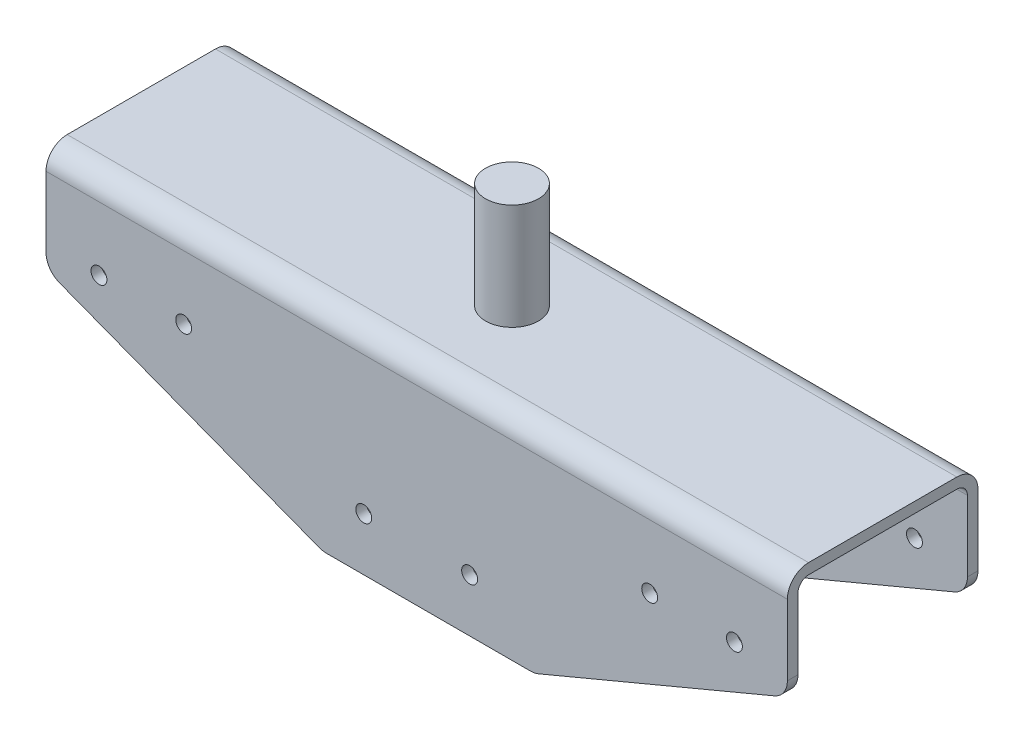
ISO-10303-21;
HEADER;
FILE_DESCRIPTION(('STEP AP214'),'2;1');
FILE_NAME('part.step','',(''),(''),'','','');
FILE_SCHEMA(('AUTOMOTIVE_DESIGN { 1 0 10303 214 1 1 1 1 }'));
ENDSEC;
DATA;
#1=APPLICATION_CONTEXT('core data for automotive mechanical design processes');
#2=APPLICATION_PROTOCOL_DEFINITION('international standard','automotive_design',2000,#1);
#3=PRODUCT_CONTEXT('',#1,'mechanical');
#4=PRODUCT('Part','Part','',(#3));
#5=PRODUCT_RELATED_PRODUCT_CATEGORY('part','',(#4));
#6=PRODUCT_DEFINITION_FORMATION('','',#4);
#7=PRODUCT_DEFINITION_CONTEXT('part definition',#1,'design');
#8=PRODUCT_DEFINITION('design','',#6,#7);
#9=PRODUCT_DEFINITION_SHAPE('','',#8);
#10=(LENGTH_UNIT() NAMED_UNIT(*) SI_UNIT(.MILLI.,.METRE.));
#11=(NAMED_UNIT(*) PLANE_ANGLE_UNIT() SI_UNIT($,.RADIAN.));
#12=(NAMED_UNIT(*) SI_UNIT($,.STERADIAN.) SOLID_ANGLE_UNIT());
#13=UNCERTAINTY_MEASURE_WITH_UNIT(LENGTH_MEASURE(1.E-05),#10,'distance_accuracy_value','');
#14=(GEOMETRIC_REPRESENTATION_CONTEXT(3) GLOBAL_UNCERTAINTY_ASSIGNED_CONTEXT((#13)) GLOBAL_UNIT_ASSIGNED_CONTEXT((#10,
#11,#12)) REPRESENTATION_CONTEXT('',''));
#15=CARTESIAN_POINT('',(0.,0.,0.));
#16=DIRECTION('',(0.,0.,1.));
#17=DIRECTION('',(1.,0.,0.));
#18=AXIS2_PLACEMENT_3D('',#15,#16,#17);
#19=CARTESIAN_POINT('',(-33.,1.37609249415543,9.));
#20=DIRECTION('',(0.,0.,-1.));
#21=DIRECTION('',(-1.,0.,0.));
#22=AXIS2_PLACEMENT_3D('',#19,#20,#21);
#23=CYLINDRICAL_SURFACE('',#22,2.);
#24=CARTESIAN_POINT('',(-33.,1.37609249415543,8.));
#25=DIRECTION('',(0.,0.,1.));
#26=DIRECTION('',(1.,0.,0.));
#27=AXIS2_PLACEMENT_3D('',#24,#25,#26);
#28=CIRCLE('',#27,2.);
#29=CARTESIAN_POINT('',(-33.714795211127,-0.491812162445079,8.));
#30=VERTEX_POINT('',#29);
#31=CARTESIAN_POINT('',(-35.,1.37609249415544,8.));
#32=VERTEX_POINT('',#31);
#33=EDGE_CURVE('E275',#30,#32,#28,.F.);
#34=ORIENTED_EDGE('',*,*,#33,.F.);
#35=DIRECTION('',(0.,0.,-1.));
#36=VECTOR('',#35,1.);
#37=CARTESIAN_POINT('',(-33.714795211127,-0.491812162445079,9.));
#38=LINE('',#37,#36);
#39=CARTESIAN_POINT('',(-33.714795211127,-0.491812162445079,9.));
#40=VERTEX_POINT('',#39);
#41=EDGE_CURVE('E360',#40,#30,#38,.T.);
#42=ORIENTED_EDGE('',*,*,#41,.F.);
#43=CARTESIAN_POINT('',(-33.,1.37609249415543,9.));
#44=DIRECTION('',(0.,0.,1.));
#45=DIRECTION('',(1.,0.,0.));
#46=AXIS2_PLACEMENT_3D('',#43,#44,#45);
#47=CIRCLE('',#46,2.);
#48=CARTESIAN_POINT('',(-35.,1.37609249415544,9.));
#49=VERTEX_POINT('',#48);
#50=EDGE_CURVE('E278',#40,#49,#47,.F.);
#51=ORIENTED_EDGE('',*,*,#50,.T.);
#52=DIRECTION('',(0.,0.,-1.));
#53=VECTOR('',#52,1.);
#54=CARTESIAN_POINT('',(-35.,1.37609249415544,9.));
#55=LINE('',#54,#53);
#56=EDGE_CURVE('E327',#49,#32,#55,.T.);
#57=ORIENTED_EDGE('',*,*,#56,.T.);
#58=EDGE_LOOP('',(#34,#42,#51,#57));
#59=FACE_BOUND('',#58,.T.);
#60=ADVANCED_FACE('F35',(#59),#23,.T.);
#61=CARTESIAN_POINT('',(-4.47065669618863,-11.6827314045743,9.));
#62=DIRECTION('',(0.357397605563513,0.933952328300255,0.));
#63=DIRECTION('',(-0.933952328300255,0.357397605563513,0.));
#64=AXIS2_PLACEMENT_3D('',#61,#62,#63);
#65=PLANE('',#64);
#66=ORIENTED_EDGE('',*,*,#41,.T.);
#67=DIRECTION('',(0.933952328300255,-0.357397605563513,0.));
#68=VECTOR('',#67,1.);
#69=CARTESIAN_POINT('',(-4.47065669618863,-11.6827314045743,8.));
#70=LINE('',#69,#68);
#71=CARTESIAN_POINT('',(-9.21316655172952,-9.86790465660051,8.));
#72=VERTEX_POINT('',#71);
#73=EDGE_CURVE('E272',#30,#72,#70,.T.);
#74=ORIENTED_EDGE('',*,*,#73,.T.);
#75=DIRECTION('',(0.,0.,-1.));
#76=VECTOR('',#75,1.);
#77=CARTESIAN_POINT('',(-9.21316655172952,-9.8679046566005,9.));
#78=LINE('',#77,#76);
#79=CARTESIAN_POINT('',(-9.21316655172952,-9.8679046566005,9.));
#80=VERTEX_POINT('',#79);
#81=EDGE_CURVE('E356',#80,#72,#78,.T.);
#82=ORIENTED_EDGE('',*,*,#81,.F.);
#83=DIRECTION('',(0.933952328300255,-0.357397605563513,0.));
#84=VECTOR('',#83,1.);
#85=CARTESIAN_POINT('',(-4.47065669618863,-11.6827314045743,9.));
#86=LINE('',#85,#84);
#87=EDGE_CURVE('E281',#40,#80,#86,.T.);
#88=ORIENTED_EDGE('',*,*,#87,.F.);
#89=EDGE_LOOP('',(#66,#74,#82,#88));
#90=FACE_BOUND('',#89,.T.);
#91=ADVANCED_FACE('F482',(#90),#65,.F.);
#92=CARTESIAN_POINT('',(-8.49837134060249,-8.,9.));
#93=DIRECTION('',(0.,0.,-1.));
#94=DIRECTION('',(-1.,0.,0.));
#95=AXIS2_PLACEMENT_3D('',#92,#93,#94);
#96=CYLINDRICAL_SURFACE('',#95,2.);
#97=CARTESIAN_POINT('',(-8.49837134060249,-8.,8.));
#98=DIRECTION('',(0.,0.,1.));
#99=DIRECTION('',(1.,0.,0.));
#100=AXIS2_PLACEMENT_3D('',#97,#98,#99);
#101=CIRCLE('',#100,2.);
#102=CARTESIAN_POINT('',(-8.49837134060248,-10.,8.));
#103=VERTEX_POINT('',#102);
#104=EDGE_CURVE('E270',#103,#72,#101,.F.);
#105=ORIENTED_EDGE('',*,*,#104,.F.);
#106=DIRECTION('',(0.,0.,-1.));
#107=VECTOR('',#106,1.);
#108=CARTESIAN_POINT('',(-8.49837134060248,-10.,9.));
#109=LINE('',#108,#107);
#110=CARTESIAN_POINT('',(-8.49837134060248,-10.,9.));
#111=VERTEX_POINT('',#110);
#112=EDGE_CURVE('E352',#111,#103,#109,.T.);
#113=ORIENTED_EDGE('',*,*,#112,.F.);
#114=CARTESIAN_POINT('',(-8.49837134060249,-8.,9.));
#115=DIRECTION('',(0.,0.,1.));
#116=DIRECTION('',(1.,0.,0.));
#117=AXIS2_PLACEMENT_3D('',#114,#115,#116);
#118=CIRCLE('',#117,2.);
#119=EDGE_CURVE('E284',#111,#80,#118,.F.);
#120=ORIENTED_EDGE('',*,*,#119,.T.);
#121=ORIENTED_EDGE('',*,*,#81,.T.);
#122=EDGE_LOOP('',(#105,#113,#120,#121));
#123=FACE_BOUND('',#122,.T.);
#124=ADVANCED_FACE('F488',(#123),#96,.T.);
#125=CARTESIAN_POINT('',(0.,-10.,9.));
#126=DIRECTION('',(0.,1.,0.));
#127=DIRECTION('',(0.,0.,1.));
#128=AXIS2_PLACEMENT_3D('',#125,#126,#127);
#129=PLANE('',#128);
#130=ORIENTED_EDGE('',*,*,#112,.T.);
#131=DIRECTION('',(1.,0.,0.));
#132=VECTOR('',#131,1.);
#133=CARTESIAN_POINT('',(0.,-10.,8.));
#134=LINE('',#133,#132);
#135=CARTESIAN_POINT('',(10.7299842112883,-10.,8.));
#136=VERTEX_POINT('',#135);
#137=EDGE_CURVE('E267',#103,#136,#134,.T.);
#138=ORIENTED_EDGE('',*,*,#137,.T.);
#139=DIRECTION('',(0.,0.,-1.));
#140=VECTOR('',#139,1.);
#141=CARTESIAN_POINT('',(10.7299842112883,-10.,9.));
#142=LINE('',#141,#140);
#143=CARTESIAN_POINT('',(10.7299842112883,-10.,9.));
#144=VERTEX_POINT('',#143);
#145=EDGE_CURVE('E348',#144,#136,#142,.T.);
#146=ORIENTED_EDGE('',*,*,#145,.F.);
#147=DIRECTION('',(1.,0.,0.));
#148=VECTOR('',#147,1.);
#149=CARTESIAN_POINT('',(0.,-10.,9.));
#150=LINE('',#149,#148);
#151=EDGE_CURVE('E287',#111,#144,#150,.T.);
#152=ORIENTED_EDGE('',*,*,#151,.F.);
#153=EDGE_LOOP('',(#130,#138,#146,#152));
#154=FACE_BOUND('',#153,.T.);
#155=ADVANCED_FACE('F503',(#154),#129,.F.);
#156=CARTESIAN_POINT('',(10.7299842112883,-8.,9.));
#157=DIRECTION('',(0.,0.,-1.));
#158=DIRECTION('',(-1.,0.,0.));
#159=AXIS2_PLACEMENT_3D('',#156,#157,#158);
#160=CYLINDRICAL_SURFACE('',#159,2.);
#161=CARTESIAN_POINT('',(10.7299842112883,-8.,8.));
#162=DIRECTION('',(0.,0.,1.));
#163=DIRECTION('',(1.,0.,0.));
#164=AXIS2_PLACEMENT_3D('',#161,#162,#163);
#165=CIRCLE('',#164,2.);
#166=CARTESIAN_POINT('',(11.5028360804316,-9.8446408833054,8.));
#167=VERTEX_POINT('',#166);
#168=EDGE_CURVE('E265',#167,#136,#165,.F.);
#169=ORIENTED_EDGE('',*,*,#168,.F.);
#170=DIRECTION('',(0.,0.,-1.));
#171=VECTOR('',#170,1.);
#172=CARTESIAN_POINT('',(11.5028360804316,-9.8446408833054,9.));
#173=LINE('',#172,#171);
#174=CARTESIAN_POINT('',(11.5028360804316,-9.8446408833054,9.));
#175=VERTEX_POINT('',#174);
#176=EDGE_CURVE('E344',#175,#167,#173,.T.);
#177=ORIENTED_EDGE('',*,*,#176,.F.);
#178=CARTESIAN_POINT('',(10.7299842112883,-8.,9.));
#179=DIRECTION('',(0.,0.,1.));
#180=DIRECTION('',(1.,0.,0.));
#181=AXIS2_PLACEMENT_3D('',#178,#179,#180);
#182=CIRCLE('',#181,2.);
#183=EDGE_CURVE('E289',#175,#144,#182,.F.);
#184=ORIENTED_EDGE('',*,*,#183,.T.);
#185=ORIENTED_EDGE('',*,*,#145,.T.);
#186=EDGE_LOOP('',(#169,#177,#184,#185));
#187=FACE_BOUND('',#186,.T.);
#188=ADVANCED_FACE('F505',(#187),#160,.T.);
#189=CARTESIAN_POINT('',(5.22637510183502,-12.4742988524063,9.));
#190=DIRECTION('',(-0.386425934571649,0.922320441652698,0.));
#191=DIRECTION('',(-0.922320441652698,-0.386425934571649,0.));
#192=AXIS2_PLACEMENT_3D('',#189,#190,#191);
#193=PLANE('',#192);
#194=ORIENTED_EDGE('',*,*,#176,.T.);
#195=DIRECTION('',(0.922320441652698,0.386425934571649,0.));
#196=VECTOR('',#195,1.);
#197=CARTESIAN_POINT('',(5.22637510183502,-12.4742988524063,8.));
#198=LINE('',#197,#196);
#199=CARTESIAN_POINT('',(33.7728518691433,-0.514140034101853,8.));
#200=VERTEX_POINT('',#199);
#201=EDGE_CURVE('E262',#167,#200,#198,.T.);
#202=ORIENTED_EDGE('',*,*,#201,.T.);
#203=DIRECTION('',(0.,0.,-1.));
#204=VECTOR('',#203,1.);
#205=CARTESIAN_POINT('',(33.7728518691433,-0.514140034101855,9.));
#206=LINE('',#205,#204);
#207=CARTESIAN_POINT('',(33.7728518691433,-0.514140034101855,9.));
#208=VERTEX_POINT('',#207);
#209=EDGE_CURVE('E340',#208,#200,#206,.T.);
#210=ORIENTED_EDGE('',*,*,#209,.F.);
#211=DIRECTION('',(0.922320441652698,0.386425934571649,0.));
#212=VECTOR('',#211,1.);
#213=CARTESIAN_POINT('',(5.22637510183502,-12.4742988524063,9.));
#214=LINE('',#213,#212);
#215=EDGE_CURVE('E292',#175,#208,#214,.T.);
#216=ORIENTED_EDGE('',*,*,#215,.F.);
#217=EDGE_LOOP('',(#194,#202,#210,#216));
#218=FACE_BOUND('',#217,.T.);
#219=ADVANCED_FACE('F478',(#218),#193,.F.);
#220=CARTESIAN_POINT('',(33.,1.33050084920354,9.));
#221=DIRECTION('',(0.,0.,-1.));
#222=DIRECTION('',(-1.,0.,0.));
#223=AXIS2_PLACEMENT_3D('',#220,#221,#222);
#224=CYLINDRICAL_SURFACE('',#223,2.);
#225=CARTESIAN_POINT('',(33.,1.33050084920354,8.));
#226=DIRECTION('',(0.,0.,1.));
#227=DIRECTION('',(1.,0.,0.));
#228=AXIS2_PLACEMENT_3D('',#225,#226,#227);
#229=CIRCLE('',#228,2.);
#230=CARTESIAN_POINT('',(35.,1.33050084920355,8.));
#231=VERTEX_POINT('',#230);
#232=EDGE_CURVE('E260',#231,#200,#229,.F.);
#233=ORIENTED_EDGE('',*,*,#232,.F.);
#234=DIRECTION('',(0.,0.,-1.));
#235=VECTOR('',#234,1.);
#236=CARTESIAN_POINT('',(35.,1.33050084920355,9.));
#237=LINE('',#236,#235);
#238=CARTESIAN_POINT('',(35.,1.33050084920355,9.));
#239=VERTEX_POINT('',#238);
#240=EDGE_CURVE('E337',#239,#231,#237,.T.);
#241=ORIENTED_EDGE('',*,*,#240,.F.);
#242=CARTESIAN_POINT('',(33.,1.33050084920354,9.));
#243=DIRECTION('',(0.,0.,1.));
#244=DIRECTION('',(1.,0.,0.));
#245=AXIS2_PLACEMENT_3D('',#242,#243,#244);
#246=CIRCLE('',#245,2.);
#247=EDGE_CURVE('E294',#239,#208,#246,.F.);
#248=ORIENTED_EDGE('',*,*,#247,.T.);
#249=ORIENTED_EDGE('',*,*,#209,.T.);
#250=EDGE_LOOP('',(#233,#241,#248,#249));
#251=FACE_BOUND('',#250,.T.);
#252=ADVANCED_FACE('F471',(#251),#224,.T.);
#253=CARTESIAN_POINT('',(-33.,1.37609249415543,-8.));
#254=DIRECTION('',(0.,0.,-1.));
#255=DIRECTION('',(-1.,0.,0.));
#256=AXIS2_PLACEMENT_3D('',#253,#254,#255);
#257=CIRCLE('',#256,2.);
#258=CARTESIAN_POINT('',(-35.,1.37609249415544,-8.));
#259=VERTEX_POINT('',#258);
#260=CARTESIAN_POINT('',(-33.714795211127,-0.491812162445079,-8.));
#261=VERTEX_POINT('',#260);
#262=EDGE_CURVE('E258',#259,#261,#257,.F.);
#263=ORIENTED_EDGE('',*,*,#262,.F.);
#264=CARTESIAN_POINT('',(-35.,1.37609249415544,-9.));
#265=VERTEX_POINT('',#264);
#266=EDGE_CURVE('E301',#259,#265,#55,.T.);
#267=ORIENTED_EDGE('',*,*,#266,.T.);
#268=CARTESIAN_POINT('',(-33.,1.37609249415543,-9.));
#269=DIRECTION('',(0.,0.,1.));
#270=DIRECTION('',(1.,0.,0.));
#271=AXIS2_PLACEMENT_3D('',#268,#269,#270);
#272=CIRCLE('',#271,2.);
#273=CARTESIAN_POINT('',(-33.714795211127,-0.491812162445079,-9.));
#274=VERTEX_POINT('',#273);
#275=EDGE_CURVE('E277',#274,#265,#272,.F.);
#276=ORIENTED_EDGE('',*,*,#275,.F.);
#277=EDGE_CURVE('E359',#261,#274,#38,.T.);
#278=ORIENTED_EDGE('',*,*,#277,.F.);
#279=EDGE_LOOP('',(#263,#267,#276,#278));
#280=FACE_BOUND('',#279,.T.);
#281=ADVANCED_FACE('F444',(#280),#23,.T.);
#282=CARTESIAN_POINT('',(-9.21316655172952,-9.86790465660051,-8.));
#283=VERTEX_POINT('',#282);
#284=CARTESIAN_POINT('',(-9.21316655172952,-9.8679046566005,-9.));
#285=VERTEX_POINT('',#284);
#286=EDGE_CURVE('E355',#283,#285,#78,.T.);
#287=ORIENTED_EDGE('',*,*,#286,.F.);
#288=DIRECTION('',(-0.933952328300255,0.357397605563513,0.));
#289=VECTOR('',#288,1.);
#290=CARTESIAN_POINT('',(-4.47065669618863,-11.6827314045743,-8.));
#291=LINE('',#290,#289);
#292=EDGE_CURVE('E255',#283,#261,#291,.T.);
#293=ORIENTED_EDGE('',*,*,#292,.T.);
#294=ORIENTED_EDGE('',*,*,#277,.T.);
#295=DIRECTION('',(0.933952328300255,-0.357397605563513,0.));
#296=VECTOR('',#295,1.);
#297=CARTESIAN_POINT('',(-4.47065669618863,-11.6827314045743,-9.));
#298=LINE('',#297,#296);
#299=EDGE_CURVE('E304',#274,#285,#298,.T.);
#300=ORIENTED_EDGE('',*,*,#299,.T.);
#301=EDGE_LOOP('',(#287,#293,#294,#300));
#302=FACE_BOUND('',#301,.T.);
#303=ADVANCED_FACE('F448',(#302),#65,.F.);
#304=CARTESIAN_POINT('',(-8.49837134060249,-8.,-8.));
#305=DIRECTION('',(0.,0.,-1.));
#306=DIRECTION('',(-1.,0.,0.));
#307=AXIS2_PLACEMENT_3D('',#304,#305,#306);
#308=CIRCLE('',#307,2.);
#309=CARTESIAN_POINT('',(-8.49837134060248,-10.,-8.));
#310=VERTEX_POINT('',#309);
#311=EDGE_CURVE('E253',#283,#310,#308,.F.);
#312=ORIENTED_EDGE('',*,*,#311,.F.);
#313=ORIENTED_EDGE('',*,*,#286,.T.);
#314=CARTESIAN_POINT('',(-8.49837134060249,-8.,-9.));
#315=DIRECTION('',(0.,0.,1.));
#316=DIRECTION('',(1.,0.,0.));
#317=AXIS2_PLACEMENT_3D('',#314,#315,#316);
#318=CIRCLE('',#317,2.);
#319=CARTESIAN_POINT('',(-8.49837134060248,-10.,-9.));
#320=VERTEX_POINT('',#319);
#321=EDGE_CURVE('E307',#320,#285,#318,.F.);
#322=ORIENTED_EDGE('',*,*,#321,.F.);
#323=EDGE_CURVE('E351',#310,#320,#109,.T.);
#324=ORIENTED_EDGE('',*,*,#323,.F.);
#325=EDGE_LOOP('',(#312,#313,#322,#324));
#326=FACE_BOUND('',#325,.T.);
#327=ADVANCED_FACE('F451',(#326),#96,.T.);
#328=CARTESIAN_POINT('',(10.7299842112883,-10.,-8.));
#329=VERTEX_POINT('',#328);
#330=CARTESIAN_POINT('',(10.7299842112883,-10.,-9.));
#331=VERTEX_POINT('',#330);
#332=EDGE_CURVE('E347',#329,#331,#142,.T.);
#333=ORIENTED_EDGE('',*,*,#332,.F.);
#334=DIRECTION('',(-1.,0.,0.));
#335=VECTOR('',#334,1.);
#336=CARTESIAN_POINT('',(0.,-10.,-8.));
#337=LINE('',#336,#335);
#338=EDGE_CURVE('E250',#329,#310,#337,.T.);
#339=ORIENTED_EDGE('',*,*,#338,.T.);
#340=ORIENTED_EDGE('',*,*,#323,.T.);
#341=DIRECTION('',(1.,0.,0.));
#342=VECTOR('',#341,1.);
#343=CARTESIAN_POINT('',(0.,-10.,-9.));
#344=LINE('',#343,#342);
#345=EDGE_CURVE('E310',#320,#331,#344,.T.);
#346=ORIENTED_EDGE('',*,*,#345,.T.);
#347=EDGE_LOOP('',(#333,#339,#340,#346));
#348=FACE_BOUND('',#347,.T.);
#349=ADVANCED_FACE('F456',(#348),#129,.F.);
#350=CARTESIAN_POINT('',(10.7299842112883,-8.,-8.));
#351=DIRECTION('',(0.,0.,-1.));
#352=DIRECTION('',(-1.,0.,0.));
#353=AXIS2_PLACEMENT_3D('',#350,#351,#352);
#354=CIRCLE('',#353,2.);
#355=CARTESIAN_POINT('',(11.5028360804316,-9.8446408833054,-8.));
#356=VERTEX_POINT('',#355);
#357=EDGE_CURVE('E248',#329,#356,#354,.F.);
#358=ORIENTED_EDGE('',*,*,#357,.F.);
#359=ORIENTED_EDGE('',*,*,#332,.T.);
#360=CARTESIAN_POINT('',(10.7299842112883,-8.,-9.));
#361=DIRECTION('',(0.,0.,1.));
#362=DIRECTION('',(1.,0.,0.));
#363=AXIS2_PLACEMENT_3D('',#360,#361,#362);
#364=CIRCLE('',#363,2.);
#365=CARTESIAN_POINT('',(11.5028360804316,-9.8446408833054,-9.));
#366=VERTEX_POINT('',#365);
#367=EDGE_CURVE('E313',#366,#331,#364,.F.);
#368=ORIENTED_EDGE('',*,*,#367,.F.);
#369=EDGE_CURVE('E343',#356,#366,#173,.T.);
#370=ORIENTED_EDGE('',*,*,#369,.F.);
#371=EDGE_LOOP('',(#358,#359,#368,#370));
#372=FACE_BOUND('',#371,.T.);
#373=ADVANCED_FACE('F460',(#372),#160,.T.);
#374=CARTESIAN_POINT('',(33.7728518691433,-0.514140034101853,-8.));
#375=VERTEX_POINT('',#374);
#376=CARTESIAN_POINT('',(33.7728518691433,-0.514140034101855,-9.));
#377=VERTEX_POINT('',#376);
#378=EDGE_CURVE('E339',#375,#377,#206,.T.);
#379=ORIENTED_EDGE('',*,*,#378,.F.);
#380=DIRECTION('',(-0.922320441652698,-0.386425934571649,0.));
#381=VECTOR('',#380,1.);
#382=CARTESIAN_POINT('',(5.22637510183502,-12.4742988524063,-8.));
#383=LINE('',#382,#381);
#384=EDGE_CURVE('E245',#375,#356,#383,.T.);
#385=ORIENTED_EDGE('',*,*,#384,.T.);
#386=ORIENTED_EDGE('',*,*,#369,.T.);
#387=DIRECTION('',(0.922320441652698,0.386425934571649,0.));
#388=VECTOR('',#387,1.);
#389=CARTESIAN_POINT('',(5.22637510183502,-12.4742988524063,-9.));
#390=LINE('',#389,#388);
#391=EDGE_CURVE('E316',#366,#377,#390,.T.);
#392=ORIENTED_EDGE('',*,*,#391,.T.);
#393=EDGE_LOOP('',(#379,#385,#386,#392));
#394=FACE_BOUND('',#393,.T.);
#395=ADVANCED_FACE('F464',(#394),#193,.F.);
#396=CARTESIAN_POINT('',(33.,1.33050084920354,-8.));
#397=DIRECTION('',(0.,0.,-1.));
#398=DIRECTION('',(-1.,0.,0.));
#399=AXIS2_PLACEMENT_3D('',#396,#397,#398);
#400=CIRCLE('',#399,2.);
#401=CARTESIAN_POINT('',(35.,1.33050084920355,-8.));
#402=VERTEX_POINT('',#401);
#403=EDGE_CURVE('E203',#375,#402,#400,.F.);
#404=ORIENTED_EDGE('',*,*,#403,.F.);
#405=ORIENTED_EDGE('',*,*,#378,.T.);
#406=CARTESIAN_POINT('',(33.,1.33050084920354,-9.));
#407=DIRECTION('',(0.,0.,1.));
#408=DIRECTION('',(1.,0.,0.));
#409=AXIS2_PLACEMENT_3D('',#406,#407,#408);
#410=CIRCLE('',#409,2.);
#411=CARTESIAN_POINT('',(35.,1.33050084920355,-9.));
#412=VERTEX_POINT('',#411);
#413=EDGE_CURVE('E319',#412,#377,#410,.F.);
#414=ORIENTED_EDGE('',*,*,#413,.F.);
#415=EDGE_CURVE('E336',#402,#412,#237,.T.);
#416=ORIENTED_EDGE('',*,*,#415,.F.);
#417=EDGE_LOOP('',(#404,#405,#414,#416));
#418=FACE_BOUND('',#417,.T.);
#419=ADVANCED_FACE('F468',(#418),#224,.T.);
#420=CARTESIAN_POINT('',(35.,0.,9.));
#421=DIRECTION('',(-1.,0.,0.));
#422=DIRECTION('',(0.,0.,1.));
#423=AXIS2_PLACEMENT_3D('',#420,#421,#422);
#424=PLANE('',#423);
#425=ORIENTED_EDGE('',*,*,#240,.T.);
#426=DIRECTION('',(0.,-1.,0.));
#427=VECTOR('',#426,1.);
#428=CARTESIAN_POINT('',(35.,8.,8.));
#429=LINE('',#428,#427);
#430=CARTESIAN_POINT('',(35.,8.,8.));
#431=VERTEX_POINT('',#430);
#432=EDGE_CURVE('E228',#431,#231,#429,.T.);
#433=ORIENTED_EDGE('',*,*,#432,.F.);
#434=CARTESIAN_POINT('',(35.,8.,7.));
#435=DIRECTION('',(1.,0.,0.));
#436=DIRECTION('',(0.,0.,-1.));
#437=AXIS2_PLACEMENT_3D('',#434,#435,#436);
#438=CIRCLE('',#437,1.);
#439=CARTESIAN_POINT('',(35.,9.,7.));
#440=VERTEX_POINT('',#439);
#441=EDGE_CURVE('E222',#440,#431,#438,.T.);
#442=ORIENTED_EDGE('',*,*,#441,.F.);
#443=DIRECTION('',(0.,0.,1.));
#444=VECTOR('',#443,1.);
#445=CARTESIAN_POINT('',(35.,9.,7.));
#446=LINE('',#445,#444);
#447=CARTESIAN_POINT('',(35.,9.,-7.));
#448=VERTEX_POINT('',#447);
#449=EDGE_CURVE('E220',#448,#440,#446,.T.);
#450=ORIENTED_EDGE('',*,*,#449,.F.);
#451=CARTESIAN_POINT('',(35.,8.,-7.));
#452=DIRECTION('',(1.,0.,0.));
#453=DIRECTION('',(0.,0.,-1.));
#454=AXIS2_PLACEMENT_3D('',#451,#452,#453);
#455=CIRCLE('',#454,1.);
#456=CARTESIAN_POINT('',(35.,8.,-8.));
#457=VERTEX_POINT('',#456);
#458=EDGE_CURVE('E207',#457,#448,#455,.T.);
#459=ORIENTED_EDGE('',*,*,#458,.F.);
#460=DIRECTION('',(0.,1.,0.));
#461=VECTOR('',#460,1.);
#462=CARTESIAN_POINT('',(35.,-14.234256749177,-8.));
#463=LINE('',#462,#461);
#464=EDGE_CURVE('E198',#402,#457,#463,.T.);
#465=ORIENTED_EDGE('',*,*,#464,.F.);
#466=ORIENTED_EDGE('',*,*,#415,.T.);
#467=DIRECTION('',(0.,1.,0.));
#468=VECTOR('',#467,1.);
#469=CARTESIAN_POINT('',(35.,0.,-9.));
#470=LINE('',#469,#468);
#471=CARTESIAN_POINT('',(35.,8.,-9.));
#472=VERTEX_POINT('',#471);
#473=EDGE_CURVE('E322',#412,#472,#470,.T.);
#474=ORIENTED_EDGE('',*,*,#473,.T.);
#475=CARTESIAN_POINT('',(35.,8.,-7.));
#476=DIRECTION('',(-1.,0.,0.));
#477=DIRECTION('',(0.,0.,1.));
#478=AXIS2_PLACEMENT_3D('',#475,#476,#477);
#479=CIRCLE('',#478,2.);
#480=CARTESIAN_POINT('',(35.,10.,-7.));
#481=VERTEX_POINT('',#480);
#482=EDGE_CURVE('E368',#472,#481,#479,.F.);
#483=ORIENTED_EDGE('',*,*,#482,.T.);
#484=DIRECTION('',(0.,0.,-1.));
#485=VECTOR('',#484,1.);
#486=CARTESIAN_POINT('',(35.,10.,9.));
#487=LINE('',#486,#485);
#488=CARTESIAN_POINT('',(35.,10.,7.));
#489=VERTEX_POINT('',#488);
#490=EDGE_CURVE('E333',#489,#481,#487,.T.);
#491=ORIENTED_EDGE('',*,*,#490,.F.);
#492=CARTESIAN_POINT('',(35.,8.,7.));
#493=DIRECTION('',(-1.,0.,0.));
#494=DIRECTION('',(0.,0.,1.));
#495=AXIS2_PLACEMENT_3D('',#492,#493,#494);
#496=CIRCLE('',#495,2.);
#497=CARTESIAN_POINT('',(35.,8.,9.));
#498=VERTEX_POINT('',#497);
#499=EDGE_CURVE('E366',#489,#498,#496,.F.);
#500=ORIENTED_EDGE('',*,*,#499,.T.);
#501=DIRECTION('',(0.,1.,0.));
#502=VECTOR('',#501,1.);
#503=CARTESIAN_POINT('',(35.,0.,9.));
#504=LINE('',#503,#502);
#505=EDGE_CURVE('E297',#239,#498,#504,.T.);
#506=ORIENTED_EDGE('',*,*,#505,.F.);
#507=EDGE_LOOP('',(#425,#433,#442,#450,#459,#465,#466,#474,#483,#491,#500,#506));
#508=FACE_BOUND('',#507,.T.);
#509=ADVANCED_FACE('F217',(#508),#424,.F.);
#510=CARTESIAN_POINT('',(0.,10.,9.));
#511=DIRECTION('',(0.,1.,0.));
#512=DIRECTION('',(0.,0.,1.));
#513=AXIS2_PLACEMENT_3D('',#510,#511,#512);
#514=PLANE('',#513);
#515=CARTESIAN_POINT('',(0.,10.,0.));
#516=DIRECTION('',(0.,1.,0.));
#517=DIRECTION('',(0.,0.,1.));
#518=AXIS2_PLACEMENT_3D('',#515,#516,#517);
#519=CIRCLE('',#518,2.5);
#520=CARTESIAN_POINT('',(0.,10.,2.5));
#521=VERTEX_POINT('',#520);
#522=EDGE_CURVE('E413',#521,#521,#519,.T.);
#523=ORIENTED_EDGE('',*,*,#522,.F.);
#524=EDGE_LOOP('',(#523));
#525=FACE_BOUND('',#524,.T.);
#526=ORIENTED_EDGE('',*,*,#490,.T.);
#527=DIRECTION('',(1.,0.,0.));
#528=VECTOR('',#527,1.);
#529=CARTESIAN_POINT('',(-35.,10.,-7.));
#530=LINE('',#529,#528);
#531=CARTESIAN_POINT('',(-35.,10.,-7.));
#532=VERTEX_POINT('',#531);
#533=EDGE_CURVE('E373',#481,#532,#530,.F.);
#534=ORIENTED_EDGE('',*,*,#533,.T.);
#535=DIRECTION('',(0.,0.,-1.));
#536=VECTOR('',#535,1.);
#537=CARTESIAN_POINT('',(-35.,10.,9.));
#538=LINE('',#537,#536);
#539=CARTESIAN_POINT('',(-35.,10.,7.));
#540=VERTEX_POINT('',#539);
#541=EDGE_CURVE('E330',#540,#532,#538,.T.);
#542=ORIENTED_EDGE('',*,*,#541,.F.);
#543=DIRECTION('',(1.,0.,0.));
#544=VECTOR('',#543,1.);
#545=CARTESIAN_POINT('',(0.,10.,7.));
#546=LINE('',#545,#544);
#547=EDGE_CURVE('E370',#540,#489,#546,.T.);
#548=ORIENTED_EDGE('',*,*,#547,.T.);
#549=EDGE_LOOP('',(#526,#534,#542,#548));
#550=FACE_BOUND('',#549,.T.);
#551=ADVANCED_FACE('F420',(#525,#550),#514,.T.);
#552=CARTESIAN_POINT('',(-35.,0.,9.));
#553=DIRECTION('',(-1.,0.,0.));
#554=DIRECTION('',(0.,0.,1.));
#555=AXIS2_PLACEMENT_3D('',#552,#553,#554);
#556=PLANE('',#555);
#557=DIRECTION('',(0.,-1.,0.));
#558=VECTOR('',#557,1.);
#559=CARTESIAN_POINT('',(-35.,8.,8.));
#560=LINE('',#559,#558);
#561=CARTESIAN_POINT('',(-35.,8.,8.));
#562=VERTEX_POINT('',#561);
#563=EDGE_CURVE('E214',#562,#32,#560,.T.);
#564=ORIENTED_EDGE('',*,*,#563,.T.);
#565=ORIENTED_EDGE('',*,*,#56,.F.);
#566=DIRECTION('',(0.,1.,0.));
#567=VECTOR('',#566,1.);
#568=CARTESIAN_POINT('',(-35.,0.,9.));
#569=LINE('',#568,#567);
#570=CARTESIAN_POINT('',(-35.,8.,9.));
#571=VERTEX_POINT('',#570);
#572=EDGE_CURVE('E299',#49,#571,#569,.T.);
#573=ORIENTED_EDGE('',*,*,#572,.T.);
#574=CARTESIAN_POINT('',(-35.,8.,7.));
#575=DIRECTION('',(-1.,0.,0.));
#576=DIRECTION('',(0.,0.,1.));
#577=AXIS2_PLACEMENT_3D('',#574,#575,#576);
#578=CIRCLE('',#577,2.);
#579=EDGE_CURVE('E375',#571,#540,#578,.T.);
#580=ORIENTED_EDGE('',*,*,#579,.T.);
#581=ORIENTED_EDGE('',*,*,#541,.T.);
#582=CARTESIAN_POINT('',(-35.,8.,-7.));
#583=DIRECTION('',(-1.,0.,0.));
#584=DIRECTION('',(0.,0.,1.));
#585=AXIS2_PLACEMENT_3D('',#582,#583,#584);
#586=CIRCLE('',#585,2.);
#587=CARTESIAN_POINT('',(-35.,8.,-9.));
#588=VERTEX_POINT('',#587);
#589=EDGE_CURVE('E377',#532,#588,#586,.T.);
#590=ORIENTED_EDGE('',*,*,#589,.T.);
#591=DIRECTION('',(0.,1.,0.));
#592=VECTOR('',#591,1.);
#593=CARTESIAN_POINT('',(-35.,0.,-9.));
#594=LINE('',#593,#592);
#595=EDGE_CURVE('E282',#265,#588,#594,.T.);
#596=ORIENTED_EDGE('',*,*,#595,.F.);
#597=ORIENTED_EDGE('',*,*,#266,.F.);
#598=DIRECTION('',(0.,-1.,0.));
#599=VECTOR('',#598,1.);
#600=CARTESIAN_POINT('',(-35.,0.,-8.));
#601=LINE('',#600,#599);
#602=CARTESIAN_POINT('',(-35.,8.,-8.));
#603=VERTEX_POINT('',#602);
#604=EDGE_CURVE('E11',#603,#259,#601,.T.);
#605=ORIENTED_EDGE('',*,*,#604,.F.);
#606=CARTESIAN_POINT('',(-35.,8.,-7.));
#607=DIRECTION('',(1.,0.,0.));
#608=DIRECTION('',(0.,0.,-1.));
#609=AXIS2_PLACEMENT_3D('',#606,#607,#608);
#610=CIRCLE('',#609,1.);
#611=CARTESIAN_POINT('',(-35.,9.,-7.));
#612=VERTEX_POINT('',#611);
#613=EDGE_CURVE('E52',#603,#612,#610,.T.);
#614=ORIENTED_EDGE('',*,*,#613,.T.);
#615=DIRECTION('',(0.,0.,1.));
#616=VECTOR('',#615,1.);
#617=CARTESIAN_POINT('',(-35.,9.,7.));
#618=LINE('',#617,#616);
#619=CARTESIAN_POINT('',(-35.,9.,7.));
#620=VERTEX_POINT('',#619);
#621=EDGE_CURVE('E231',#612,#620,#618,.T.);
#622=ORIENTED_EDGE('',*,*,#621,.T.);
#623=CARTESIAN_POINT('',(-35.,8.,7.));
#624=DIRECTION('',(1.,0.,0.));
#625=DIRECTION('',(0.,0.,-1.));
#626=AXIS2_PLACEMENT_3D('',#623,#624,#625);
#627=CIRCLE('',#626,1.);
#628=EDGE_CURVE('E234',#620,#562,#627,.T.);
#629=ORIENTED_EDGE('',*,*,#628,.T.);
#630=EDGE_LOOP('',(#564,#565,#573,#580,#581,#590,#596,#597,#605,#614,#622,#629));
#631=FACE_BOUND('',#630,.T.);
#632=ADVANCED_FACE('F423',(#631),#556,.T.);
#633=CARTESIAN_POINT('',(0.,0.,9.));
#634=DIRECTION('',(0.,0.,1.));
#635=DIRECTION('',(1.,0.,0.));
#636=AXIS2_PLACEMENT_3D('',#633,#634,#635);
#637=PLANE('',#636);
#638=CARTESIAN_POINT('',(-30.,2.,9.));
#639=DIRECTION('',(0.,0.,1.));
#640=DIRECTION('',(1.,0.,0.));
#641=AXIS2_PLACEMENT_3D('',#638,#639,#640);
#642=CIRCLE('',#641,0.750000000000002);
#643=CARTESIAN_POINT('',(-29.25,2.,9.));
#644=VERTEX_POINT('',#643);
#645=EDGE_CURVE('E859',#644,#644,#642,.T.);
#646=ORIENTED_EDGE('',*,*,#645,.F.);
#647=EDGE_LOOP('',(#646));
#648=FACE_BOUND('',#647,.T.);
#649=CARTESIAN_POINT('',(-22.,2.,9.));
#650=DIRECTION('',(0.,0.,1.));
#651=DIRECTION('',(1.,0.,0.));
#652=AXIS2_PLACEMENT_3D('',#649,#650,#651);
#653=CIRCLE('',#652,0.750000000000002);
#654=CARTESIAN_POINT('',(-21.25,2.,9.));
#655=VERTEX_POINT('',#654);
#656=EDGE_CURVE('E897',#655,#655,#653,.T.);
#657=ORIENTED_EDGE('',*,*,#656,.F.);
#658=EDGE_LOOP('',(#657));
#659=FACE_BOUND('',#658,.T.);
#660=CARTESIAN_POINT('',(-5.,-5.,9.));
#661=DIRECTION('',(0.,0.,1.));
#662=DIRECTION('',(1.,0.,0.));
#663=AXIS2_PLACEMENT_3D('',#660,#661,#662);
#664=CIRCLE('',#663,0.75);
#665=CARTESIAN_POINT('',(-4.25,-5.,9.));
#666=VERTEX_POINT('',#665);
#667=EDGE_CURVE('E891',#666,#666,#664,.T.);
#668=ORIENTED_EDGE('',*,*,#667,.F.);
#669=EDGE_LOOP('',(#668));
#670=FACE_BOUND('',#669,.T.);
#671=CARTESIAN_POINT('',(5.,-5.,9.));
#672=DIRECTION('',(0.,0.,1.));
#673=DIRECTION('',(-1.,0.,0.));
#674=AXIS2_PLACEMENT_3D('',#671,#672,#673);
#675=CIRCLE('',#674,0.75);
#676=CARTESIAN_POINT('',(4.25,-5.,9.));
#677=VERTEX_POINT('',#676);
#678=EDGE_CURVE('E885',#677,#677,#675,.T.);
#679=ORIENTED_EDGE('',*,*,#678,.F.);
#680=EDGE_LOOP('',(#679));
#681=FACE_BOUND('',#680,.T.);
#682=CARTESIAN_POINT('',(22.,2.,9.));
#683=DIRECTION('',(0.,0.,1.));
#684=DIRECTION('',(-1.,0.,0.));
#685=AXIS2_PLACEMENT_3D('',#682,#683,#684);
#686=CIRCLE('',#685,0.750000000000002);
#687=CARTESIAN_POINT('',(21.25,2.,9.));
#688=VERTEX_POINT('',#687);
#689=EDGE_CURVE('E878',#688,#688,#686,.T.);
#690=ORIENTED_EDGE('',*,*,#689,.F.);
#691=EDGE_LOOP('',(#690));
#692=FACE_BOUND('',#691,.T.);
#693=CARTESIAN_POINT('',(30.,2.,9.));
#694=DIRECTION('',(0.,0.,1.));
#695=DIRECTION('',(-1.,0.,0.));
#696=AXIS2_PLACEMENT_3D('',#693,#694,#695);
#697=CIRCLE('',#696,0.750000000000002);
#698=CARTESIAN_POINT('',(29.25,2.,9.));
#699=VERTEX_POINT('',#698);
#700=EDGE_CURVE('E879',#699,#699,#697,.T.);
#701=ORIENTED_EDGE('',*,*,#700,.F.);
#702=EDGE_LOOP('',(#701));
#703=FACE_BOUND('',#702,.T.);
#704=ORIENTED_EDGE('',*,*,#505,.T.);
#705=DIRECTION('',(1.,0.,0.));
#706=VECTOR('',#705,1.);
#707=CARTESIAN_POINT('',(0.,8.,9.));
#708=LINE('',#707,#706);
#709=EDGE_CURVE('E44',#498,#571,#708,.F.);
#710=ORIENTED_EDGE('',*,*,#709,.T.);
#711=ORIENTED_EDGE('',*,*,#572,.F.);
#712=ORIENTED_EDGE('',*,*,#50,.F.);
#713=ORIENTED_EDGE('',*,*,#87,.T.);
#714=ORIENTED_EDGE('',*,*,#119,.F.);
#715=ORIENTED_EDGE('',*,*,#151,.T.);
#716=ORIENTED_EDGE('',*,*,#183,.F.);
#717=ORIENTED_EDGE('',*,*,#215,.T.);
#718=ORIENTED_EDGE('',*,*,#247,.F.);
#719=EDGE_LOOP('',(#704,#710,#711,#712,#713,#714,#715,#716,#717,#718));
#720=FACE_BOUND('',#719,.T.);
#721=ADVANCED_FACE('F523',(#648,#659,#670,#681,#692,#703,#720),#637,.T.);
#722=CARTESIAN_POINT('',(0.,0.,-9.));
#723=DIRECTION('',(0.,0.,1.));
#724=DIRECTION('',(1.,0.,0.));
#725=AXIS2_PLACEMENT_3D('',#722,#723,#724);
#726=PLANE('',#725);
#727=CARTESIAN_POINT('',(-30.,2.,-9.));
#728=DIRECTION('',(0.,0.,1.));
#729=DIRECTION('',(1.,0.,0.));
#730=AXIS2_PLACEMENT_3D('',#727,#728,#729);
#731=CIRCLE('',#730,0.750000000000002);
#732=CARTESIAN_POINT('',(-29.25,2.,-9.));
#733=VERTEX_POINT('',#732);
#734=EDGE_CURVE('E384',#733,#733,#731,.T.);
#735=ORIENTED_EDGE('',*,*,#734,.T.);
#736=EDGE_LOOP('',(#735));
#737=FACE_BOUND('',#736,.T.);
#738=CARTESIAN_POINT('',(-22.,2.,-9.));
#739=DIRECTION('',(0.,0.,1.));
#740=DIRECTION('',(1.,0.,0.));
#741=AXIS2_PLACEMENT_3D('',#738,#739,#740);
#742=CIRCLE('',#741,0.750000000000002);
#743=CARTESIAN_POINT('',(-21.25,2.,-9.));
#744=VERTEX_POINT('',#743);
#745=EDGE_CURVE('E900',#744,#744,#742,.T.);
#746=ORIENTED_EDGE('',*,*,#745,.T.);
#747=EDGE_LOOP('',(#746));
#748=FACE_BOUND('',#747,.T.);
#749=CARTESIAN_POINT('',(-5.,-5.,-9.));
#750=DIRECTION('',(0.,0.,1.));
#751=DIRECTION('',(1.,0.,0.));
#752=AXIS2_PLACEMENT_3D('',#749,#750,#751);
#753=CIRCLE('',#752,0.75);
#754=CARTESIAN_POINT('',(-4.25,-5.,-9.));
#755=VERTEX_POINT('',#754);
#756=EDGE_CURVE('E894',#755,#755,#753,.T.);
#757=ORIENTED_EDGE('',*,*,#756,.T.);
#758=EDGE_LOOP('',(#757));
#759=FACE_BOUND('',#758,.T.);
#760=CARTESIAN_POINT('',(5.,-5.,-9.));
#761=DIRECTION('',(0.,0.,1.));
#762=DIRECTION('',(-1.,0.,0.));
#763=AXIS2_PLACEMENT_3D('',#760,#761,#762);
#764=CIRCLE('',#763,0.75);
#765=CARTESIAN_POINT('',(4.25,-5.,-9.));
#766=VERTEX_POINT('',#765);
#767=EDGE_CURVE('E888',#766,#766,#764,.T.);
#768=ORIENTED_EDGE('',*,*,#767,.T.);
#769=EDGE_LOOP('',(#768));
#770=FACE_BOUND('',#769,.T.);
#771=CARTESIAN_POINT('',(22.,2.,-9.));
#772=DIRECTION('',(0.,0.,1.));
#773=DIRECTION('',(-1.,0.,0.));
#774=AXIS2_PLACEMENT_3D('',#771,#772,#773);
#775=CIRCLE('',#774,0.750000000000002);
#776=CARTESIAN_POINT('',(21.25,2.,-9.));
#777=VERTEX_POINT('',#776);
#778=EDGE_CURVE('E882',#777,#777,#775,.T.);
#779=ORIENTED_EDGE('',*,*,#778,.T.);
#780=EDGE_LOOP('',(#779));
#781=FACE_BOUND('',#780,.T.);
#782=CARTESIAN_POINT('',(30.,2.,-9.));
#783=DIRECTION('',(0.,0.,1.));
#784=DIRECTION('',(-1.,0.,0.));
#785=AXIS2_PLACEMENT_3D('',#782,#783,#784);
#786=CIRCLE('',#785,0.750000000000002);
#787=CARTESIAN_POINT('',(29.25,2.,-9.));
#788=VERTEX_POINT('',#787);
#789=EDGE_CURVE('E875',#788,#788,#786,.T.);
#790=ORIENTED_EDGE('',*,*,#789,.T.);
#791=EDGE_LOOP('',(#790));
#792=FACE_BOUND('',#791,.T.);
#793=ORIENTED_EDGE('',*,*,#595,.T.);
#794=DIRECTION('',(1.,0.,0.));
#795=VECTOR('',#794,1.);
#796=CARTESIAN_POINT('',(35.,8.,-9.));
#797=LINE('',#796,#795);
#798=EDGE_CURVE('E363',#588,#472,#797,.T.);
#799=ORIENTED_EDGE('',*,*,#798,.T.);
#800=ORIENTED_EDGE('',*,*,#473,.F.);
#801=ORIENTED_EDGE('',*,*,#413,.T.);
#802=ORIENTED_EDGE('',*,*,#391,.F.);
#803=ORIENTED_EDGE('',*,*,#367,.T.);
#804=ORIENTED_EDGE('',*,*,#345,.F.);
#805=ORIENTED_EDGE('',*,*,#321,.T.);
#806=ORIENTED_EDGE('',*,*,#299,.F.);
#807=ORIENTED_EDGE('',*,*,#275,.T.);
#808=EDGE_LOOP('',(#793,#799,#800,#801,#802,#803,#804,#805,#806,#807));
#809=FACE_BOUND('',#808,.T.);
#810=ADVANCED_FACE('F437',(#737,#748,#759,#770,#781,#792,#809),#726,.F.);
#811=CARTESIAN_POINT('',(0.,8.,-7.));
#812=DIRECTION('',(-1.,0.,0.));
#813=DIRECTION('',(0.,0.,1.));
#814=AXIS2_PLACEMENT_3D('',#811,#812,#813);
#815=CYLINDRICAL_SURFACE('',#814,2.);
#816=ORIENTED_EDGE('',*,*,#589,.F.);
#817=ORIENTED_EDGE('',*,*,#533,.F.);
#818=ORIENTED_EDGE('',*,*,#482,.F.);
#819=ORIENTED_EDGE('',*,*,#798,.F.);
#820=EDGE_LOOP('',(#816,#817,#818,#819));
#821=FACE_BOUND('',#820,.T.);
#822=ADVANCED_FACE('F431',(#821),#815,.T.);
#823=CARTESIAN_POINT('',(0.,8.,7.));
#824=DIRECTION('',(1.,0.,0.));
#825=DIRECTION('',(0.,0.,-1.));
#826=AXIS2_PLACEMENT_3D('',#823,#824,#825);
#827=CYLINDRICAL_SURFACE('',#826,2.);
#828=ORIENTED_EDGE('',*,*,#579,.F.);
#829=ORIENTED_EDGE('',*,*,#709,.F.);
#830=ORIENTED_EDGE('',*,*,#499,.F.);
#831=ORIENTED_EDGE('',*,*,#547,.F.);
#832=EDGE_LOOP('',(#828,#829,#830,#831));
#833=FACE_BOUND('',#832,.T.);
#834=ADVANCED_FACE('F37',(#833),#827,.T.);
#835=CARTESIAN_POINT('',(-35.,8.,8.));
#836=DIRECTION('',(0.,0.,1.));
#837=DIRECTION('',(1.,0.,0.));
#838=AXIS2_PLACEMENT_3D('',#835,#836,#837);
#839=PLANE('',#838);
#840=CARTESIAN_POINT('',(-30.,2.,8.));
#841=DIRECTION('',(0.,0.,1.));
#842=DIRECTION('',(1.,0.,0.));
#843=AXIS2_PLACEMENT_3D('',#840,#841,#842);
#844=CIRCLE('',#843,0.750000000000002);
#845=CARTESIAN_POINT('',(-29.25,2.,8.));
#846=VERTEX_POINT('',#845);
#847=EDGE_CURVE('E410',#846,#846,#844,.T.);
#848=ORIENTED_EDGE('',*,*,#847,.T.);
#849=EDGE_LOOP('',(#848));
#850=FACE_BOUND('',#849,.T.);
#851=CARTESIAN_POINT('',(-22.,2.,8.));
#852=DIRECTION('',(0.,0.,1.));
#853=DIRECTION('',(1.,0.,0.));
#854=AXIS2_PLACEMENT_3D('',#851,#852,#853);
#855=CIRCLE('',#854,0.750000000000002);
#856=CARTESIAN_POINT('',(-21.25,2.,8.));
#857=VERTEX_POINT('',#856);
#858=EDGE_CURVE('E398',#857,#857,#855,.T.);
#859=ORIENTED_EDGE('',*,*,#858,.T.);
#860=EDGE_LOOP('',(#859));
#861=FACE_BOUND('',#860,.T.);
#862=CARTESIAN_POINT('',(-5.,-5.,8.));
#863=DIRECTION('',(0.,0.,1.));
#864=DIRECTION('',(1.,0.,0.));
#865=AXIS2_PLACEMENT_3D('',#862,#863,#864);
#866=CIRCLE('',#865,0.75);
#867=CARTESIAN_POINT('',(-4.25,-5.,8.));
#868=VERTEX_POINT('',#867);
#869=EDGE_CURVE('E395',#868,#868,#866,.T.);
#870=ORIENTED_EDGE('',*,*,#869,.T.);
#871=EDGE_LOOP('',(#870));
#872=FACE_BOUND('',#871,.T.);
#873=CARTESIAN_POINT('',(5.,-5.,8.));
#874=DIRECTION('',(0.,0.,1.));
#875=DIRECTION('',(1.,0.,0.));
#876=AXIS2_PLACEMENT_3D('',#873,#874,#875);
#877=CIRCLE('',#876,0.75);
#878=CARTESIAN_POINT('',(5.75,-5.,8.));
#879=VERTEX_POINT('',#878);
#880=EDGE_CURVE('E392',#879,#879,#877,.T.);
#881=ORIENTED_EDGE('',*,*,#880,.T.);
#882=EDGE_LOOP('',(#881));
#883=FACE_BOUND('',#882,.T.);
#884=CARTESIAN_POINT('',(22.,2.,8.));
#885=DIRECTION('',(0.,0.,1.));
#886=DIRECTION('',(1.,0.,0.));
#887=AXIS2_PLACEMENT_3D('',#884,#885,#886);
#888=CIRCLE('',#887,0.750000000000002);
#889=CARTESIAN_POINT('',(22.75,2.,8.));
#890=VERTEX_POINT('',#889);
#891=EDGE_CURVE('E388',#890,#890,#888,.T.);
#892=ORIENTED_EDGE('',*,*,#891,.T.);
#893=EDGE_LOOP('',(#892));
#894=FACE_BOUND('',#893,.T.);
#895=CARTESIAN_POINT('',(30.,2.,8.));
#896=DIRECTION('',(0.,0.,1.));
#897=DIRECTION('',(1.,0.,0.));
#898=AXIS2_PLACEMENT_3D('',#895,#896,#897);
#899=CIRCLE('',#898,0.750000000000002);
#900=CARTESIAN_POINT('',(30.75,2.,8.));
#901=VERTEX_POINT('',#900);
#902=EDGE_CURVE('E383',#901,#901,#899,.T.);
#903=ORIENTED_EDGE('',*,*,#902,.T.);
#904=EDGE_LOOP('',(#903));
#905=FACE_BOUND('',#904,.T.);
#906=ORIENTED_EDGE('',*,*,#33,.T.);
#907=ORIENTED_EDGE('',*,*,#563,.F.);
#908=DIRECTION('',(1.,0.,0.));
#909=VECTOR('',#908,1.);
#910=CARTESIAN_POINT('',(-35.,8.,8.));
#911=LINE('',#910,#909);
#912=EDGE_CURVE('E239',#562,#431,#911,.T.);
#913=ORIENTED_EDGE('',*,*,#912,.T.);
#914=ORIENTED_EDGE('',*,*,#432,.T.);
#915=ORIENTED_EDGE('',*,*,#232,.T.);
#916=ORIENTED_EDGE('',*,*,#201,.F.);
#917=ORIENTED_EDGE('',*,*,#168,.T.);
#918=ORIENTED_EDGE('',*,*,#137,.F.);
#919=ORIENTED_EDGE('',*,*,#104,.T.);
#920=ORIENTED_EDGE('',*,*,#73,.F.);
#921=EDGE_LOOP('',(#906,#907,#913,#914,#915,#916,#917,#918,#919,#920));
#922=FACE_BOUND('',#921,.T.);
#923=ADVANCED_FACE('F527',(#850,#861,#872,#883,#894,#905,#922),#839,.F.);
#924=CARTESIAN_POINT('',(-35.,8.,7.));
#925=DIRECTION('',(1.,0.,0.));
#926=DIRECTION('',(0.,0.,-1.));
#927=AXIS2_PLACEMENT_3D('',#924,#925,#926);
#928=CYLINDRICAL_SURFACE('',#927,1.);
#929=ORIENTED_EDGE('',*,*,#912,.F.);
#930=ORIENTED_EDGE('',*,*,#628,.F.);
#931=DIRECTION('',(1.,0.,0.));
#932=VECTOR('',#931,1.);
#933=CARTESIAN_POINT('',(-35.,9.,7.));
#934=LINE('',#933,#932);
#935=EDGE_CURVE('E241',#620,#440,#934,.T.);
#936=ORIENTED_EDGE('',*,*,#935,.T.);
#937=ORIENTED_EDGE('',*,*,#441,.T.);
#938=EDGE_LOOP('',(#929,#930,#936,#937));
#939=FACE_BOUND('',#938,.T.);
#940=ADVANCED_FACE('F538',(#939),#928,.F.);
#941=CARTESIAN_POINT('',(-35.,9.,7.));
#942=DIRECTION('',(0.,1.,0.));
#943=DIRECTION('',(0.,0.,1.));
#944=AXIS2_PLACEMENT_3D('',#941,#942,#943);
#945=PLANE('',#944);
#946=ORIENTED_EDGE('',*,*,#935,.F.);
#947=ORIENTED_EDGE('',*,*,#621,.F.);
#948=DIRECTION('',(1.,0.,0.));
#949=VECTOR('',#948,1.);
#950=CARTESIAN_POINT('',(-35.,9.,-7.));
#951=LINE('',#950,#949);
#952=EDGE_CURVE('E213',#612,#448,#951,.T.);
#953=ORIENTED_EDGE('',*,*,#952,.T.);
#954=ORIENTED_EDGE('',*,*,#449,.T.);
#955=EDGE_LOOP('',(#946,#947,#953,#954));
#956=FACE_BOUND('',#955,.T.);
#957=ADVANCED_FACE('F731',(#956),#945,.F.);
#958=CARTESIAN_POINT('',(-35.,8.,-7.));
#959=DIRECTION('',(1.,0.,0.));
#960=DIRECTION('',(0.,0.,-1.));
#961=AXIS2_PLACEMENT_3D('',#958,#959,#960);
#962=CYLINDRICAL_SURFACE('',#961,1.);
#963=ORIENTED_EDGE('',*,*,#952,.F.);
#964=ORIENTED_EDGE('',*,*,#613,.F.);
#965=DIRECTION('',(1.,0.,0.));
#966=VECTOR('',#965,1.);
#967=CARTESIAN_POINT('',(-35.,8.,-8.));
#968=LINE('',#967,#966);
#969=EDGE_CURVE('E200',#603,#457,#968,.T.);
#970=ORIENTED_EDGE('',*,*,#969,.T.);
#971=ORIENTED_EDGE('',*,*,#458,.T.);
#972=EDGE_LOOP('',(#963,#964,#970,#971));
#973=FACE_BOUND('',#972,.T.);
#974=ADVANCED_FACE('F211',(#973),#962,.F.);
#975=CARTESIAN_POINT('',(-35.,8.,-8.));
#976=DIRECTION('',(0.,0.,-1.));
#977=DIRECTION('',(-1.,0.,0.));
#978=AXIS2_PLACEMENT_3D('',#975,#976,#977);
#979=PLANE('',#978);
#980=CARTESIAN_POINT('',(-30.,2.,-8.));
#981=DIRECTION('',(0.,0.,-1.));
#982=DIRECTION('',(-1.,0.,0.));
#983=AXIS2_PLACEMENT_3D('',#980,#981,#982);
#984=CIRCLE('',#983,0.750000000000002);
#985=CARTESIAN_POINT('',(-30.75,2.,-8.));
#986=VERTEX_POINT('',#985);
#987=EDGE_CURVE('E39',#986,#986,#984,.T.);
#988=ORIENTED_EDGE('',*,*,#987,.T.);
#989=EDGE_LOOP('',(#988));
#990=FACE_BOUND('',#989,.T.);
#991=CARTESIAN_POINT('',(-22.,2.,-8.));
#992=DIRECTION('',(0.,0.,-1.));
#993=DIRECTION('',(-1.,0.,0.));
#994=AXIS2_PLACEMENT_3D('',#991,#992,#993);
#995=CIRCLE('',#994,0.750000000000002);
#996=CARTESIAN_POINT('',(-22.75,2.,-8.));
#997=VERTEX_POINT('',#996);
#998=EDGE_CURVE('E396',#997,#997,#995,.T.);
#999=ORIENTED_EDGE('',*,*,#998,.T.);
#1000=EDGE_LOOP('',(#999));
#1001=FACE_BOUND('',#1000,.T.);
#1002=CARTESIAN_POINT('',(-5.,-5.,-8.));
#1003=DIRECTION('',(0.,0.,-1.));
#1004=DIRECTION('',(-1.,0.,0.));
#1005=AXIS2_PLACEMENT_3D('',#1002,#1003,#1004);
#1006=CIRCLE('',#1005,0.75);
#1007=CARTESIAN_POINT('',(-5.75,-5.,-8.));
#1008=VERTEX_POINT('',#1007);
#1009=EDGE_CURVE('E393',#1008,#1008,#1006,.T.);
#1010=ORIENTED_EDGE('',*,*,#1009,.T.);
#1011=EDGE_LOOP('',(#1010));
#1012=FACE_BOUND('',#1011,.T.);
#1013=CARTESIAN_POINT('',(5.,-5.,-8.));
#1014=DIRECTION('',(0.,0.,-1.));
#1015=DIRECTION('',(-1.,0.,0.));
#1016=AXIS2_PLACEMENT_3D('',#1013,#1014,#1015);
#1017=CIRCLE('',#1016,0.75);
#1018=CARTESIAN_POINT('',(4.25,-5.,-8.));
#1019=VERTEX_POINT('',#1018);
#1020=EDGE_CURVE('E389',#1019,#1019,#1017,.T.);
#1021=ORIENTED_EDGE('',*,*,#1020,.T.);
#1022=EDGE_LOOP('',(#1021));
#1023=FACE_BOUND('',#1022,.T.);
#1024=CARTESIAN_POINT('',(22.,2.,-8.));
#1025=DIRECTION('',(0.,0.,-1.));
#1026=DIRECTION('',(-1.,0.,0.));
#1027=AXIS2_PLACEMENT_3D('',#1024,#1025,#1026);
#1028=CIRCLE('',#1027,0.750000000000002);
#1029=CARTESIAN_POINT('',(21.25,2.,-8.));
#1030=VERTEX_POINT('',#1029);
#1031=EDGE_CURVE('E385',#1030,#1030,#1028,.T.);
#1032=ORIENTED_EDGE('',*,*,#1031,.T.);
#1033=EDGE_LOOP('',(#1032));
#1034=FACE_BOUND('',#1033,.T.);
#1035=CARTESIAN_POINT('',(30.,2.,-8.));
#1036=DIRECTION('',(0.,0.,-1.));
#1037=DIRECTION('',(-1.,0.,0.));
#1038=AXIS2_PLACEMENT_3D('',#1035,#1036,#1037);
#1039=CIRCLE('',#1038,0.750000000000002);
#1040=CARTESIAN_POINT('',(29.25,2.,-8.));
#1041=VERTEX_POINT('',#1040);
#1042=EDGE_CURVE('E380',#1041,#1041,#1039,.T.);
#1043=ORIENTED_EDGE('',*,*,#1042,.T.);
#1044=EDGE_LOOP('',(#1043));
#1045=FACE_BOUND('',#1044,.T.);
#1046=ORIENTED_EDGE('',*,*,#262,.T.);
#1047=ORIENTED_EDGE('',*,*,#292,.F.);
#1048=ORIENTED_EDGE('',*,*,#311,.T.);
#1049=ORIENTED_EDGE('',*,*,#338,.F.);
#1050=ORIENTED_EDGE('',*,*,#357,.T.);
#1051=ORIENTED_EDGE('',*,*,#384,.F.);
#1052=ORIENTED_EDGE('',*,*,#403,.T.);
#1053=ORIENTED_EDGE('',*,*,#464,.T.);
#1054=ORIENTED_EDGE('',*,*,#969,.F.);
#1055=ORIENTED_EDGE('',*,*,#604,.T.);
#1056=EDGE_LOOP('',(#1046,#1047,#1048,#1049,#1050,#1051,#1052,#1053,#1054,#1055));
#1057=FACE_BOUND('',#1056,.T.);
#1058=ADVANCED_FACE('F199',(#990,#1001,#1012,#1023,#1034,#1045,#1057),#979,.F.);
#1059=CARTESIAN_POINT('',(0.,20.,0.));
#1060=DIRECTION('',(0.,-1.,0.));
#1061=DIRECTION('',(0.,0.,-1.));
#1062=AXIS2_PLACEMENT_3D('',#1059,#1060,#1061);
#1063=CYLINDRICAL_SURFACE('',#1062,2.5);
#1064=CARTESIAN_POINT('',(0.,20.,0.));
#1065=DIRECTION('',(0.,1.,0.));
#1066=DIRECTION('',(0.,0.,1.));
#1067=AXIS2_PLACEMENT_3D('',#1064,#1065,#1066);
#1068=CIRCLE('',#1067,2.5);
#1069=CARTESIAN_POINT('',(0.,20.,2.5));
#1070=VERTEX_POINT('',#1069);
#1071=EDGE_CURVE('E208',#1070,#1070,#1068,.T.);
#1072=ORIENTED_EDGE('',*,*,#1071,.F.);
#1073=EDGE_LOOP('',(#1072));
#1074=FACE_BOUND('',#1073,.T.);
#1075=ORIENTED_EDGE('',*,*,#522,.T.);
#1076=EDGE_LOOP('',(#1075));
#1077=FACE_BOUND('',#1076,.T.);
#1078=ADVANCED_FACE('F418',(#1074,#1077),#1063,.T.);
#1079=CARTESIAN_POINT('',(0.,20.,0.));
#1080=DIRECTION('',(0.,1.,0.));
#1081=DIRECTION('',(0.,0.,1.));
#1082=AXIS2_PLACEMENT_3D('',#1079,#1080,#1081);
#1083=PLANE('',#1082);
#1084=ORIENTED_EDGE('',*,*,#1071,.T.);
#1085=EDGE_LOOP('',(#1084));
#1086=FACE_BOUND('',#1085,.T.);
#1087=ADVANCED_FACE('F579',(#1086),#1083,.T.);
#1088=CARTESIAN_POINT('',(30.,2.,-9.));
#1089=DIRECTION('',(0.,0.,1.));
#1090=DIRECTION('',(1.,0.,0.));
#1091=AXIS2_PLACEMENT_3D('',#1088,#1089,#1090);
#1092=CYLINDRICAL_SURFACE('',#1091,0.750000000000002);
#1093=ORIENTED_EDGE('',*,*,#789,.F.);
#1094=EDGE_LOOP('',(#1093));
#1095=FACE_BOUND('',#1094,.T.);
#1096=ORIENTED_EDGE('',*,*,#1042,.F.);
#1097=EDGE_LOOP('',(#1096));
#1098=FACE_BOUND('',#1097,.T.);
#1099=ADVANCED_FACE('F610',(#1095,#1098),#1092,.F.);
#1100=CARTESIAN_POINT('',(22.,2.,-9.));
#1101=DIRECTION('',(0.,0.,1.));
#1102=DIRECTION('',(1.,0.,0.));
#1103=AXIS2_PLACEMENT_3D('',#1100,#1101,#1102);
#1104=CYLINDRICAL_SURFACE('',#1103,0.750000000000002);
#1105=ORIENTED_EDGE('',*,*,#778,.F.);
#1106=EDGE_LOOP('',(#1105));
#1107=FACE_BOUND('',#1106,.T.);
#1108=ORIENTED_EDGE('',*,*,#1031,.F.);
#1109=EDGE_LOOP('',(#1108));
#1110=FACE_BOUND('',#1109,.T.);
#1111=ADVANCED_FACE('F615',(#1107,#1110),#1104,.F.);
#1112=CARTESIAN_POINT('',(5.,-5.,-9.));
#1113=DIRECTION('',(0.,0.,1.));
#1114=DIRECTION('',(1.,0.,0.));
#1115=AXIS2_PLACEMENT_3D('',#1112,#1113,#1114);
#1116=CYLINDRICAL_SURFACE('',#1115,0.75);
#1117=ORIENTED_EDGE('',*,*,#767,.F.);
#1118=EDGE_LOOP('',(#1117));
#1119=FACE_BOUND('',#1118,.T.);
#1120=ORIENTED_EDGE('',*,*,#1020,.F.);
#1121=EDGE_LOOP('',(#1120));
#1122=FACE_BOUND('',#1121,.T.);
#1123=ADVANCED_FACE('F626',(#1119,#1122),#1116,.F.);
#1124=CARTESIAN_POINT('',(-5.,-5.,-9.));
#1125=DIRECTION('',(0.,0.,1.));
#1126=DIRECTION('',(1.,0.,0.));
#1127=AXIS2_PLACEMENT_3D('',#1124,#1125,#1126);
#1128=CYLINDRICAL_SURFACE('',#1127,0.75);
#1129=ORIENTED_EDGE('',*,*,#756,.F.);
#1130=EDGE_LOOP('',(#1129));
#1131=FACE_BOUND('',#1130,.T.);
#1132=ORIENTED_EDGE('',*,*,#1009,.F.);
#1133=EDGE_LOOP('',(#1132));
#1134=FACE_BOUND('',#1133,.T.);
#1135=ADVANCED_FACE('F637',(#1131,#1134),#1128,.F.);
#1136=CARTESIAN_POINT('',(-22.,2.,-9.));
#1137=DIRECTION('',(0.,0.,1.));
#1138=DIRECTION('',(1.,0.,0.));
#1139=AXIS2_PLACEMENT_3D('',#1136,#1137,#1138);
#1140=CYLINDRICAL_SURFACE('',#1139,0.750000000000002);
#1141=ORIENTED_EDGE('',*,*,#745,.F.);
#1142=EDGE_LOOP('',(#1141));
#1143=FACE_BOUND('',#1142,.T.);
#1144=ORIENTED_EDGE('',*,*,#998,.F.);
#1145=EDGE_LOOP('',(#1144));
#1146=FACE_BOUND('',#1145,.T.);
#1147=ADVANCED_FACE('F648',(#1143,#1146),#1140,.F.);
#1148=CARTESIAN_POINT('',(-30.,2.,-9.));
#1149=DIRECTION('',(0.,0.,1.));
#1150=DIRECTION('',(1.,0.,0.));
#1151=AXIS2_PLACEMENT_3D('',#1148,#1149,#1150);
#1152=CYLINDRICAL_SURFACE('',#1151,0.750000000000002);
#1153=ORIENTED_EDGE('',*,*,#734,.F.);
#1154=EDGE_LOOP('',(#1153));
#1155=FACE_BOUND('',#1154,.T.);
#1156=ORIENTED_EDGE('',*,*,#987,.F.);
#1157=EDGE_LOOP('',(#1156));
#1158=FACE_BOUND('',#1157,.T.);
#1159=ADVANCED_FACE('F659',(#1155,#1158),#1152,.F.);
#1160=ORIENTED_EDGE('',*,*,#700,.T.);
#1161=EDGE_LOOP('',(#1160));
#1162=FACE_BOUND('',#1161,.T.);
#1163=ORIENTED_EDGE('',*,*,#902,.F.);
#1164=EDGE_LOOP('',(#1163));
#1165=FACE_BOUND('',#1164,.T.);
#1166=ADVANCED_FACE('F618',(#1162,#1165),#1092,.F.);
#1167=ORIENTED_EDGE('',*,*,#689,.T.);
#1168=EDGE_LOOP('',(#1167));
#1169=FACE_BOUND('',#1168,.T.);
#1170=ORIENTED_EDGE('',*,*,#891,.F.);
#1171=EDGE_LOOP('',(#1170));
#1172=FACE_BOUND('',#1171,.T.);
#1173=ADVANCED_FACE('F629',(#1169,#1172),#1104,.F.);
#1174=ORIENTED_EDGE('',*,*,#678,.T.);
#1175=EDGE_LOOP('',(#1174));
#1176=FACE_BOUND('',#1175,.T.);
#1177=ORIENTED_EDGE('',*,*,#880,.F.);
#1178=EDGE_LOOP('',(#1177));
#1179=FACE_BOUND('',#1178,.T.);
#1180=ADVANCED_FACE('F640',(#1176,#1179),#1116,.F.);
#1181=ORIENTED_EDGE('',*,*,#667,.T.);
#1182=EDGE_LOOP('',(#1181));
#1183=FACE_BOUND('',#1182,.T.);
#1184=ORIENTED_EDGE('',*,*,#869,.F.);
#1185=EDGE_LOOP('',(#1184));
#1186=FACE_BOUND('',#1185,.T.);
#1187=ADVANCED_FACE('F651',(#1183,#1186),#1128,.F.);
#1188=ORIENTED_EDGE('',*,*,#656,.T.);
#1189=EDGE_LOOP('',(#1188));
#1190=FACE_BOUND('',#1189,.T.);
#1191=ORIENTED_EDGE('',*,*,#858,.F.);
#1192=EDGE_LOOP('',(#1191));
#1193=FACE_BOUND('',#1192,.T.);
#1194=ADVANCED_FACE('F662',(#1190,#1193),#1140,.F.);
#1195=ORIENTED_EDGE('',*,*,#645,.T.);
#1196=EDGE_LOOP('',(#1195));
#1197=FACE_BOUND('',#1196,.T.);
#1198=ORIENTED_EDGE('',*,*,#847,.F.);
#1199=EDGE_LOOP('',(#1198));
#1200=FACE_BOUND('',#1199,.T.);
#1201=ADVANCED_FACE('F672',(#1197,#1200),#1152,.F.);
#1202=CLOSED_SHELL('',(#60,#91,#124,#155,#188,#219,#252,#281,#303,#327,#349,#373,#395,#419,#509,
#551,#632,#721,#810,#822,#834,#923,#940,#957,#974,#1058,#1078,#1087,#1099,#1111,#1123,#1135,
#1147,#1159,#1166,#1173,#1180,#1187,#1194,#1201));
#1203=MANIFOLD_SOLID_BREP('B2',#1202);
#1204=ADVANCED_BREP_SHAPE_REPRESENTATION('',(#18,#1203),#14);
#1205=SHAPE_DEFINITION_REPRESENTATION(#9,#1204);
ENDSEC;
END-ISO-10303-21;
